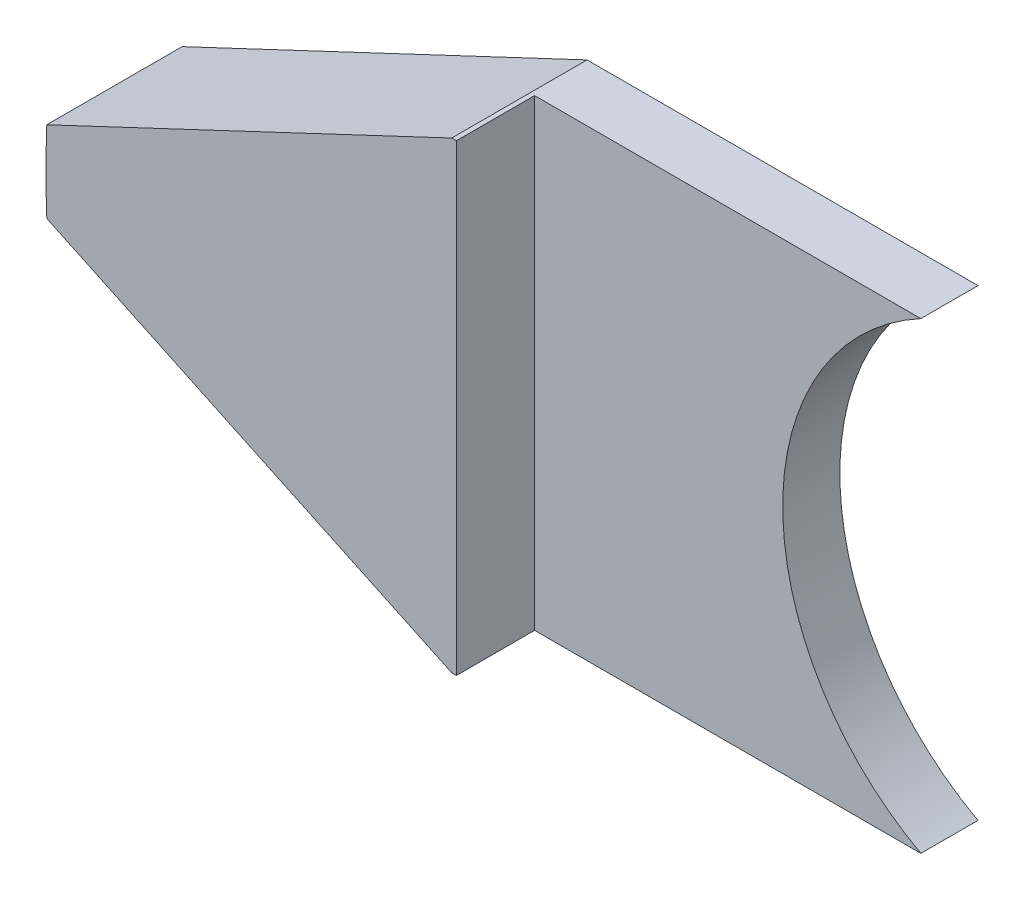
ISO-10303-21;
HEADER;
FILE_DESCRIPTION(('STEP AP214'),'2;1');
FILE_NAME('part.step','',(''),(''),'','','');
FILE_SCHEMA(('AUTOMOTIVE_DESIGN { 1 0 10303 214 1 1 1 1 }'));
ENDSEC;
DATA;
#1=APPLICATION_CONTEXT('core data for automotive mechanical design processes');
#2=APPLICATION_PROTOCOL_DEFINITION('international standard','automotive_design',2000,#1);
#3=PRODUCT_CONTEXT('',#1,'mechanical');
#4=PRODUCT('Part','Part','',(#3));
#5=PRODUCT_RELATED_PRODUCT_CATEGORY('part','',(#4));
#6=PRODUCT_DEFINITION_FORMATION('','',#4);
#7=PRODUCT_DEFINITION_CONTEXT('part definition',#1,'design');
#8=PRODUCT_DEFINITION('design','',#6,#7);
#9=PRODUCT_DEFINITION_SHAPE('','',#8);
#10=(LENGTH_UNIT() NAMED_UNIT(*) SI_UNIT(.MILLI.,.METRE.));
#11=(NAMED_UNIT(*) PLANE_ANGLE_UNIT() SI_UNIT($,.RADIAN.));
#12=(NAMED_UNIT(*) SI_UNIT($,.STERADIAN.) SOLID_ANGLE_UNIT());
#13=UNCERTAINTY_MEASURE_WITH_UNIT(LENGTH_MEASURE(1.E-05),#10,'distance_accuracy_value','');
#14=(GEOMETRIC_REPRESENTATION_CONTEXT(3) GLOBAL_UNCERTAINTY_ASSIGNED_CONTEXT((#13)) GLOBAL_UNIT_ASSIGNED_CONTEXT((#10,
#11,#12)) REPRESENTATION_CONTEXT('',''));
#15=CARTESIAN_POINT('',(0.,0.,0.));
#16=DIRECTION('',(0.,0.,1.));
#17=DIRECTION('',(1.,0.,0.));
#18=AXIS2_PLACEMENT_3D('',#15,#16,#17);
#19=CARTESIAN_POINT('',(-17.1560197304633,7.7,7.));
#20=DIRECTION('',(0.,-1.,0.));
#21=DIRECTION('',(0.,0.,-1.));
#22=AXIS2_PLACEMENT_3D('',#19,#20,#21);
#23=PLANE('',#22);
#24=DIRECTION('',(-1.,0.,0.));
#25=VECTOR('',#24,1.);
#26=CARTESIAN_POINT('',(0.,7.7,4.5));
#27=LINE('',#26,#25);
#28=CARTESIAN_POINT('',(-17.,7.7,4.5));
#29=VERTEX_POINT('',#28);
#30=CARTESIAN_POINT('',(-17.1560197304633,7.7,4.5));
#31=VERTEX_POINT('',#30);
#32=EDGE_CURVE('E104',#29,#31,#27,.T.);
#33=ORIENTED_EDGE('',*,*,#32,.F.);
#34=DIRECTION('',(0.,0.,1.));
#35=VECTOR('',#34,1.);
#36=CARTESIAN_POINT('',(-17.,7.7,1.9));
#37=LINE('',#36,#35);
#38=CARTESIAN_POINT('',(-17.,7.7,1.9));
#39=VERTEX_POINT('',#38);
#40=EDGE_CURVE('E112',#39,#29,#37,.T.);
#41=ORIENTED_EDGE('',*,*,#40,.F.);
#42=DIRECTION('',(-1.,0.,0.));
#43=VECTOR('',#42,1.);
#44=CARTESIAN_POINT('',(0.,7.7,1.9));
#45=LINE('',#44,#43);
#46=CARTESIAN_POINT('',(-4.15601973046328,7.7,1.9));
#47=VERTEX_POINT('',#46);
#48=EDGE_CURVE('E170',#47,#39,#45,.T.);
#49=ORIENTED_EDGE('',*,*,#48,.F.);
#50=DIRECTION('',(0.,0.,-1.));
#51=VECTOR('',#50,1.);
#52=CARTESIAN_POINT('',(-4.15601973046327,7.7,7.));
#53=LINE('',#52,#51);
#54=CARTESIAN_POINT('',(-4.15601973046327,7.7,0.));
#55=VERTEX_POINT('',#54);
#56=EDGE_CURVE('E61',#47,#55,#53,.T.);
#57=ORIENTED_EDGE('',*,*,#56,.T.);
#58=DIRECTION('',(-1.,0.,0.));
#59=VECTOR('',#58,1.);
#60=CARTESIAN_POINT('',(-17.1560197304633,7.7,0.));
#61=LINE('',#60,#59);
#62=CARTESIAN_POINT('',(-17.1560197304633,7.7,0.));
#63=VERTEX_POINT('',#62);
#64=EDGE_CURVE('E122',#55,#63,#61,.T.);
#65=ORIENTED_EDGE('',*,*,#64,.T.);
#66=DIRECTION('',(0.,0.,-1.));
#67=VECTOR('',#66,1.);
#68=CARTESIAN_POINT('',(-17.1560197304633,7.7,7.));
#69=LINE('',#68,#67);
#70=EDGE_CURVE('E11',#31,#63,#69,.T.);
#71=ORIENTED_EDGE('',*,*,#70,.F.);
#72=EDGE_LOOP('',(#33,#41,#49,#57,#65,#71));
#73=FACE_BOUND('',#72,.T.);
#74=ADVANCED_FACE('F39',(#73),#23,.F.);
#75=CARTESIAN_POINT('',(-17.1560197304633,7.7,7.));
#76=DIRECTION('',(0.426560745169482,-0.904458915971564,0.));
#77=DIRECTION('',(0.904458915971564,0.426560745169482,0.));
#78=AXIS2_PLACEMENT_3D('',#75,#76,#77);
#79=PLANE('',#78);
#80=DIRECTION('',(-0.904458915971564,-0.426560745169482,0.));
#81=VECTOR('',#80,1.);
#82=CARTESIAN_POINT('',(-6.09231895590867,12.9178604946989,4.5));
#83=LINE('',#82,#81);
#84=CARTESIAN_POINT('',(-30.6202547344074,1.35,4.5));
#85=VERTEX_POINT('',#84);
#86=EDGE_CURVE('E113',#31,#85,#83,.T.);
#87=ORIENTED_EDGE('',*,*,#86,.F.);
#88=ORIENTED_EDGE('',*,*,#70,.T.);
#89=DIRECTION('',(-0.904458915971564,-0.426560745169482,0.));
#90=VECTOR('',#89,1.);
#91=CARTESIAN_POINT('',(-17.1560197304633,7.7,0.));
#92=LINE('',#91,#90);
#93=CARTESIAN_POINT('',(-30.6202547344074,1.35,0.));
#94=VERTEX_POINT('',#93);
#95=EDGE_CURVE('E128',#63,#94,#92,.T.);
#96=ORIENTED_EDGE('',*,*,#95,.T.);
#97=DIRECTION('',(0.,0.,-1.));
#98=VECTOR('',#97,1.);
#99=CARTESIAN_POINT('',(-30.6202547344074,1.35,7.));
#100=LINE('',#99,#98);
#101=EDGE_CURVE('E46',#85,#94,#100,.T.);
#102=ORIENTED_EDGE('',*,*,#101,.F.);
#103=EDGE_LOOP('',(#87,#88,#96,#102));
#104=FACE_BOUND('',#103,.T.);
#105=ADVANCED_FACE('F158',(#104),#79,.F.);
#106=CARTESIAN_POINT('',(0.,0.,7.));
#107=DIRECTION('',(0.,0.,-1.));
#108=DIRECTION('',(-1.,0.,0.));
#109=AXIS2_PLACEMENT_3D('',#106,#107,#108);
#110=CYLINDRICAL_SURFACE('',#109,30.65);
#111=CARTESIAN_POINT('',(0.,0.,4.5));
#112=DIRECTION('',(0.,0.,1.));
#113=DIRECTION('',(1.,0.,0.));
#114=AXIS2_PLACEMENT_3D('',#111,#112,#113);
#115=CIRCLE('',#114,30.65);
#116=CARTESIAN_POINT('',(-30.6202547344074,-1.35,4.5));
#117=VERTEX_POINT('',#116);
#118=EDGE_CURVE('E155',#85,#117,#115,.T.);
#119=ORIENTED_EDGE('',*,*,#118,.F.);
#120=ORIENTED_EDGE('',*,*,#101,.T.);
#121=CARTESIAN_POINT('',(0.,0.,0.));
#122=DIRECTION('',(0.,0.,1.));
#123=DIRECTION('',(-1.,0.,0.));
#124=AXIS2_PLACEMENT_3D('',#121,#122,#123);
#125=CIRCLE('',#124,30.65);
#126=CARTESIAN_POINT('',(-30.6202547344074,-1.35,0.));
#127=VERTEX_POINT('',#126);
#128=EDGE_CURVE('E131',#94,#127,#125,.T.);
#129=ORIENTED_EDGE('',*,*,#128,.T.);
#130=DIRECTION('',(0.,0.,-1.));
#131=VECTOR('',#130,1.);
#132=CARTESIAN_POINT('',(-30.6202547344074,-1.35,7.));
#133=LINE('',#132,#131);
#134=EDGE_CURVE('E147',#117,#127,#133,.T.);
#135=ORIENTED_EDGE('',*,*,#134,.F.);
#136=EDGE_LOOP('',(#119,#120,#129,#135));
#137=FACE_BOUND('',#136,.T.);
#138=ADVANCED_FACE('F151',(#137),#110,.T.);
#139=CARTESIAN_POINT('',(-17.1560197304633,-7.7,7.));
#140=DIRECTION('',(0.426560745169482,0.904458915971564,0.));
#141=DIRECTION('',(-0.904458915971564,0.426560745169482,0.));
#142=AXIS2_PLACEMENT_3D('',#139,#140,#141);
#143=PLANE('',#142);
#144=DIRECTION('',(0.904458915971564,-0.426560745169482,0.));
#145=VECTOR('',#144,1.);
#146=CARTESIAN_POINT('',(-6.09231895590866,-12.9178604946989,4.5));
#147=LINE('',#146,#145);
#148=CARTESIAN_POINT('',(-17.1560197304633,-7.7,4.5));
#149=VERTEX_POINT('',#148);
#150=EDGE_CURVE('E168',#117,#149,#147,.T.);
#151=ORIENTED_EDGE('',*,*,#150,.F.);
#152=ORIENTED_EDGE('',*,*,#134,.T.);
#153=DIRECTION('',(0.904458915971564,-0.426560745169482,0.));
#154=VECTOR('',#153,1.);
#155=CARTESIAN_POINT('',(-17.1560197304633,-7.7,0.));
#156=LINE('',#155,#154);
#157=CARTESIAN_POINT('',(-17.1560197304633,-7.7,0.));
#158=VERTEX_POINT('',#157);
#159=EDGE_CURVE('E134',#127,#158,#156,.T.);
#160=ORIENTED_EDGE('',*,*,#159,.T.);
#161=DIRECTION('',(0.,0.,-1.));
#162=VECTOR('',#161,1.);
#163=CARTESIAN_POINT('',(-17.1560197304633,-7.7,7.));
#164=LINE('',#163,#162);
#165=EDGE_CURVE('E145',#149,#158,#164,.T.);
#166=ORIENTED_EDGE('',*,*,#165,.F.);
#167=EDGE_LOOP('',(#151,#152,#160,#166));
#168=FACE_BOUND('',#167,.T.);
#169=ADVANCED_FACE('F167',(#168),#143,.F.);
#170=CARTESIAN_POINT('',(-17.1560197304633,-7.7,7.));
#171=DIRECTION('',(0.,1.,0.));
#172=DIRECTION('',(-1.,0.,0.));
#173=AXIS2_PLACEMENT_3D('',#170,#171,#172);
#174=PLANE('',#173);
#175=DIRECTION('',(1.,0.,0.));
#176=VECTOR('',#175,1.);
#177=CARTESIAN_POINT('',(0.,-7.7,4.5));
#178=LINE('',#177,#176);
#179=CARTESIAN_POINT('',(-17.,-7.7,4.5));
#180=VERTEX_POINT('',#179);
#181=EDGE_CURVE('E53',#149,#180,#178,.T.);
#182=ORIENTED_EDGE('',*,*,#181,.F.);
#183=ORIENTED_EDGE('',*,*,#165,.T.);
#184=DIRECTION('',(1.,0.,0.));
#185=VECTOR('',#184,1.);
#186=CARTESIAN_POINT('',(-17.1560197304633,-7.7,0.));
#187=LINE('',#186,#185);
#188=CARTESIAN_POINT('',(-4.15601973046327,-7.7,0.));
#189=VERTEX_POINT('',#188);
#190=EDGE_CURVE('E137',#158,#189,#187,.T.);
#191=ORIENTED_EDGE('',*,*,#190,.T.);
#192=DIRECTION('',(0.,0.,-1.));
#193=VECTOR('',#192,1.);
#194=CARTESIAN_POINT('',(-4.15601973046327,-7.7,7.));
#195=LINE('',#194,#193);
#196=CARTESIAN_POINT('',(-4.15601973046327,-7.7,1.9));
#197=VERTEX_POINT('',#196);
#198=EDGE_CURVE('E143',#197,#189,#195,.T.);
#199=ORIENTED_EDGE('',*,*,#198,.F.);
#200=DIRECTION('',(1.,0.,0.));
#201=VECTOR('',#200,1.);
#202=CARTESIAN_POINT('',(0.,-7.7,1.9));
#203=LINE('',#202,#201);
#204=CARTESIAN_POINT('',(-17.,-7.7,1.9));
#205=VERTEX_POINT('',#204);
#206=EDGE_CURVE('E124',#205,#197,#203,.T.);
#207=ORIENTED_EDGE('',*,*,#206,.F.);
#208=DIRECTION('',(0.,0.,1.));
#209=VECTOR('',#208,1.);
#210=CARTESIAN_POINT('',(-17.,-7.7,1.9));
#211=LINE('',#210,#209);
#212=EDGE_CURVE('E119',#205,#180,#211,.T.);
#213=ORIENTED_EDGE('',*,*,#212,.T.);
#214=EDGE_LOOP('',(#182,#183,#191,#199,#207,#213));
#215=FACE_BOUND('',#214,.T.);
#216=ADVANCED_FACE('F185',(#215),#174,.F.);
#217=CARTESIAN_POINT('',(-17.,0.,1.9));
#218=DIRECTION('',(-1.,0.,0.));
#219=DIRECTION('',(0.,-1.,0.));
#220=AXIS2_PLACEMENT_3D('',#217,#218,#219);
#221=PLANE('',#220);
#222=DIRECTION('',(0.,-1.,0.));
#223=VECTOR('',#222,1.);
#224=CARTESIAN_POINT('',(-17.,0.,4.5));
#225=LINE('',#224,#223);
#226=EDGE_CURVE('E101',#29,#180,#225,.T.);
#227=ORIENTED_EDGE('',*,*,#226,.T.);
#228=ORIENTED_EDGE('',*,*,#212,.F.);
#229=DIRECTION('',(0.,-1.,0.));
#230=VECTOR('',#229,1.);
#231=CARTESIAN_POINT('',(-17.,0.,1.9));
#232=LINE('',#231,#230);
#233=EDGE_CURVE('E117',#39,#205,#232,.T.);
#234=ORIENTED_EDGE('',*,*,#233,.F.);
#235=ORIENTED_EDGE('',*,*,#40,.T.);
#236=EDGE_LOOP('',(#227,#228,#234,#235));
#237=FACE_BOUND('',#236,.T.);
#238=ADVANCED_FACE('F115',(#237),#221,.F.);
#239=CARTESIAN_POINT('',(0.,0.,7.));
#240=DIRECTION('',(0.,0.,-1.));
#241=DIRECTION('',(-1.,0.,0.));
#242=AXIS2_PLACEMENT_3D('',#239,#240,#241);
#243=CYLINDRICAL_SURFACE('',#242,8.75);
#244=CARTESIAN_POINT('',(0.,0.,1.9));
#245=DIRECTION('',(0.,0.,1.));
#246=DIRECTION('',(1.,0.,0.));
#247=AXIS2_PLACEMENT_3D('',#244,#245,#246);
#248=CIRCLE('',#247,8.75);
#249=EDGE_CURVE('E120',#197,#47,#248,.F.);
#250=ORIENTED_EDGE('',*,*,#249,.F.);
#251=ORIENTED_EDGE('',*,*,#198,.T.);
#252=CARTESIAN_POINT('',(0.,0.,0.));
#253=DIRECTION('',(0.,0.,-1.));
#254=DIRECTION('',(1.,0.,0.));
#255=AXIS2_PLACEMENT_3D('',#252,#253,#254);
#256=CIRCLE('',#255,8.75);
#257=EDGE_CURVE('E140',#189,#55,#256,.T.);
#258=ORIENTED_EDGE('',*,*,#257,.T.);
#259=ORIENTED_EDGE('',*,*,#56,.F.);
#260=EDGE_LOOP('',(#250,#251,#258,#259));
#261=FACE_BOUND('',#260,.T.);
#262=ADVANCED_FACE('F184',(#261),#243,.F.);
#263=CARTESIAN_POINT('',(0.,0.,0.));
#264=DIRECTION('',(0.,0.,1.));
#265=DIRECTION('',(1.,0.,0.));
#266=AXIS2_PLACEMENT_3D('',#263,#264,#265);
#267=PLANE('',#266);
#268=ORIENTED_EDGE('',*,*,#64,.F.);
#269=ORIENTED_EDGE('',*,*,#257,.F.);
#270=ORIENTED_EDGE('',*,*,#190,.F.);
#271=ORIENTED_EDGE('',*,*,#159,.F.);
#272=ORIENTED_EDGE('',*,*,#128,.F.);
#273=ORIENTED_EDGE('',*,*,#95,.F.);
#274=EDGE_LOOP('',(#268,#269,#270,#271,#272,#273));
#275=FACE_BOUND('',#274,.T.);
#276=ADVANCED_FACE('F161',(#275),#267,.F.);
#277=CARTESIAN_POINT('',(0.,0.,1.9));
#278=DIRECTION('',(0.,0.,1.));
#279=DIRECTION('',(1.,0.,0.));
#280=AXIS2_PLACEMENT_3D('',#277,#278,#279);
#281=PLANE('',#280);
#282=ORIENTED_EDGE('',*,*,#48,.T.);
#283=ORIENTED_EDGE('',*,*,#233,.T.);
#284=ORIENTED_EDGE('',*,*,#206,.T.);
#285=ORIENTED_EDGE('',*,*,#249,.T.);
#286=EDGE_LOOP('',(#282,#283,#284,#285));
#287=FACE_BOUND('',#286,.T.);
#288=ADVANCED_FACE('F180',(#287),#281,.T.);
#289=CARTESIAN_POINT('',(0.,0.,4.5));
#290=DIRECTION('',(0.,0.,1.));
#291=DIRECTION('',(1.,0.,0.));
#292=AXIS2_PLACEMENT_3D('',#289,#290,#291);
#293=PLANE('',#292);
#294=ORIENTED_EDGE('',*,*,#226,.F.);
#295=ORIENTED_EDGE('',*,*,#32,.T.);
#296=ORIENTED_EDGE('',*,*,#86,.T.);
#297=ORIENTED_EDGE('',*,*,#118,.T.);
#298=ORIENTED_EDGE('',*,*,#150,.T.);
#299=ORIENTED_EDGE('',*,*,#181,.T.);
#300=EDGE_LOOP('',(#294,#295,#296,#297,#298,#299));
#301=FACE_BOUND('',#300,.T.);
#302=ADVANCED_FACE('F103',(#301),#293,.T.);
#303=CLOSED_SHELL('',(#74,#105,#138,#169,#216,#238,#262,#276,#288,#302));
#304=MANIFOLD_SOLID_BREP('B2',#303);
#305=ADVANCED_BREP_SHAPE_REPRESENTATION('',(#18,#304),#14);
#306=SHAPE_DEFINITION_REPRESENTATION(#9,#305);
ENDSEC;
END-ISO-10303-21;
